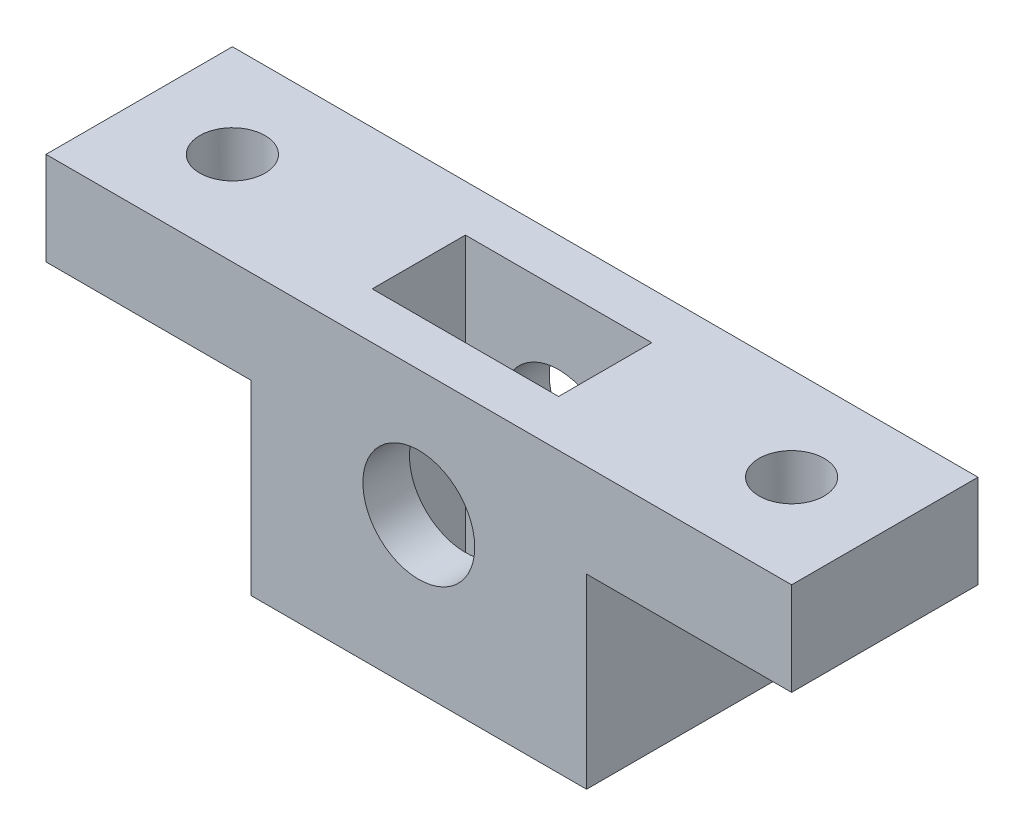
ISO-10303-21;
HEADER;
FILE_DESCRIPTION(('STEP AP214'),'2;1');
FILE_NAME('part.step','',(''),(''),'','','');
FILE_SCHEMA(('AUTOMOTIVE_DESIGN { 1 0 10303 214 1 1 1 1 }'));
ENDSEC;
DATA;
#1=APPLICATION_CONTEXT('core data for automotive mechanical design processes');
#2=APPLICATION_PROTOCOL_DEFINITION('international standard','automotive_design',2000,#1);
#3=PRODUCT_CONTEXT('',#1,'mechanical');
#4=PRODUCT('Part','Part','',(#3));
#5=PRODUCT_RELATED_PRODUCT_CATEGORY('part','',(#4));
#6=PRODUCT_DEFINITION_FORMATION('','',#4);
#7=PRODUCT_DEFINITION_CONTEXT('part definition',#1,'design');
#8=PRODUCT_DEFINITION('design','',#6,#7);
#9=PRODUCT_DEFINITION_SHAPE('','',#8);
#10=(LENGTH_UNIT() NAMED_UNIT(*) SI_UNIT(.MILLI.,.METRE.));
#11=(NAMED_UNIT(*) PLANE_ANGLE_UNIT() SI_UNIT($,.RADIAN.));
#12=(NAMED_UNIT(*) SI_UNIT($,.STERADIAN.) SOLID_ANGLE_UNIT());
#13=UNCERTAINTY_MEASURE_WITH_UNIT(LENGTH_MEASURE(1.E-05),#10,'distance_accuracy_value','');
#14=(GEOMETRIC_REPRESENTATION_CONTEXT(3) GLOBAL_UNCERTAINTY_ASSIGNED_CONTEXT((#13)) GLOBAL_UNIT_ASSIGNED_CONTEXT((#10,
#11,#12)) REPRESENTATION_CONTEXT('',''));
#15=CARTESIAN_POINT('',(0.,0.,0.));
#16=DIRECTION('',(0.,0.,1.));
#17=DIRECTION('',(1.,0.,0.));
#18=AXIS2_PLACEMENT_3D('',#15,#16,#17);
#19=CARTESIAN_POINT('',(0.,-6.74999999999999,10.));
#20=DIRECTION('',(0.,0.,-1.));
#21=DIRECTION('',(-1.,0.,0.));
#22=AXIS2_PLACEMENT_3D('',#19,#20,#21);
#23=CYLINDRICAL_SURFACE('',#22,3.);
#24=CARTESIAN_POINT('',(0.,-6.74999999999999,2.5));
#25=DIRECTION('',(0.,0.,-1.));
#26=DIRECTION('',(-1.,0.,0.));
#27=AXIS2_PLACEMENT_3D('',#24,#25,#26);
#28=CIRCLE('',#27,3.);
#29=CARTESIAN_POINT('',(-3.,-6.74999999999999,2.5));
#30=VERTEX_POINT('',#29);
#31=EDGE_CURVE('E37',#30,#30,#28,.T.);
#32=ORIENTED_EDGE('',*,*,#31,.F.);
#33=EDGE_LOOP('',(#32));
#34=FACE_BOUND('',#33,.T.);
#35=CARTESIAN_POINT('',(0.,-6.74999999999999,0.));
#36=DIRECTION('',(0.,0.,1.));
#37=DIRECTION('',(1.,0.,0.));
#38=AXIS2_PLACEMENT_3D('',#35,#36,#37);
#39=CIRCLE('',#38,3.);
#40=CARTESIAN_POINT('',(3.,-6.74999999999999,0.));
#41=VERTEX_POINT('',#40);
#42=EDGE_CURVE('E176',#41,#41,#39,.T.);
#43=ORIENTED_EDGE('',*,*,#42,.F.);
#44=EDGE_LOOP('',(#43));
#45=FACE_BOUND('',#44,.T.);
#46=ADVANCED_FACE('F33',(#34,#45),#23,.F.);
#47=CARTESIAN_POINT('',(0.,0.,10.));
#48=DIRECTION('',(0.,0.,1.));
#49=DIRECTION('',(1.,0.,0.));
#50=AXIS2_PLACEMENT_3D('',#47,#48,#49);
#51=PLANE('',#50);
#52=DIRECTION('',(0.,1.,0.));
#53=VECTOR('',#52,1.);
#54=CARTESIAN_POINT('',(9.,-5.,10.));
#55=LINE('',#54,#53);
#56=CARTESIAN_POINT('',(9.,-15.,10.));
#57=VERTEX_POINT('',#56);
#58=CARTESIAN_POINT('',(9.,-5.,10.));
#59=VERTEX_POINT('',#58);
#60=EDGE_CURVE('E179',#57,#59,#55,.T.);
#61=ORIENTED_EDGE('',*,*,#60,.T.);
#62=DIRECTION('',(1.,0.,0.));
#63=VECTOR('',#62,1.);
#64=CARTESIAN_POINT('',(20.,-4.99999999999999,10.));
#65=LINE('',#64,#63);
#66=CARTESIAN_POINT('',(20.,-4.99999999999999,10.));
#67=VERTEX_POINT('',#66);
#68=EDGE_CURVE('E182',#59,#67,#65,.T.);
#69=ORIENTED_EDGE('',*,*,#68,.T.);
#70=DIRECTION('',(0.,1.,0.));
#71=VECTOR('',#70,1.);
#72=CARTESIAN_POINT('',(20.,0.,10.));
#73=LINE('',#72,#71);
#74=CARTESIAN_POINT('',(20.,0.,10.));
#75=VERTEX_POINT('',#74);
#76=EDGE_CURVE('E185',#67,#75,#73,.T.);
#77=ORIENTED_EDGE('',*,*,#76,.T.);
#78=DIRECTION('',(-1.,0.,0.));
#79=VECTOR('',#78,1.);
#80=CARTESIAN_POINT('',(-20.,0.,10.));
#81=LINE('',#80,#79);
#82=CARTESIAN_POINT('',(-20.,0.,10.));
#83=VERTEX_POINT('',#82);
#84=EDGE_CURVE('E187',#75,#83,#81,.T.);
#85=ORIENTED_EDGE('',*,*,#84,.T.);
#86=DIRECTION('',(0.,-1.,0.));
#87=VECTOR('',#86,1.);
#88=CARTESIAN_POINT('',(-20.,0.,10.));
#89=LINE('',#88,#87);
#90=CARTESIAN_POINT('',(-20.,-5.,10.));
#91=VERTEX_POINT('',#90);
#92=EDGE_CURVE('E189',#83,#91,#89,.T.);
#93=ORIENTED_EDGE('',*,*,#92,.T.);
#94=DIRECTION('',(1.,0.,0.));
#95=VECTOR('',#94,1.);
#96=CARTESIAN_POINT('',(-20.,-5.,10.));
#97=LINE('',#96,#95);
#98=CARTESIAN_POINT('',(-9.,-5.,10.));
#99=VERTEX_POINT('',#98);
#100=EDGE_CURVE('E191',#91,#99,#97,.T.);
#101=ORIENTED_EDGE('',*,*,#100,.T.);
#102=DIRECTION('',(0.,-1.,0.));
#103=VECTOR('',#102,1.);
#104=CARTESIAN_POINT('',(-9.,-5.,10.));
#105=LINE('',#104,#103);
#106=CARTESIAN_POINT('',(-9.,-15.,10.));
#107=VERTEX_POINT('',#106);
#108=EDGE_CURVE('E193',#99,#107,#105,.T.);
#109=ORIENTED_EDGE('',*,*,#108,.T.);
#110=DIRECTION('',(1.,0.,0.));
#111=VECTOR('',#110,1.);
#112=CARTESIAN_POINT('',(-9.,-15.,10.));
#113=LINE('',#112,#111);
#114=EDGE_CURVE('E195',#107,#57,#113,.T.);
#115=ORIENTED_EDGE('',*,*,#114,.T.);
#116=EDGE_LOOP('',(#61,#69,#77,#85,#93,#101,#109,#115));
#117=FACE_BOUND('',#116,.T.);
#118=CARTESIAN_POINT('',(0.,-6.74999999999999,10.));
#119=DIRECTION('',(0.,0.,1.));
#120=DIRECTION('',(1.,0.,0.));
#121=AXIS2_PLACEMENT_3D('',#118,#119,#120);
#122=CIRCLE('',#121,3.);
#123=CARTESIAN_POINT('',(3.,-6.74999999999999,10.));
#124=VERTEX_POINT('',#123);
#125=EDGE_CURVE('E172',#124,#124,#122,.T.);
#126=ORIENTED_EDGE('',*,*,#125,.F.);
#127=EDGE_LOOP('',(#126));
#128=FACE_BOUND('',#127,.T.);
#129=ADVANCED_FACE('F244',(#117,#128),#51,.T.);
#130=CARTESIAN_POINT('',(0.,0.,0.));
#131=DIRECTION('',(0.,0.,1.));
#132=DIRECTION('',(1.,0.,0.));
#133=AXIS2_PLACEMENT_3D('',#130,#131,#132);
#134=PLANE('',#133);
#135=DIRECTION('',(0.,1.,0.));
#136=VECTOR('',#135,1.);
#137=CARTESIAN_POINT('',(9.,-5.,0.));
#138=LINE('',#137,#136);
#139=CARTESIAN_POINT('',(9.,-15.,0.));
#140=VERTEX_POINT('',#139);
#141=CARTESIAN_POINT('',(9.,-5.,0.));
#142=VERTEX_POINT('',#141);
#143=EDGE_CURVE('E175',#140,#142,#138,.T.);
#144=ORIENTED_EDGE('',*,*,#143,.F.);
#145=DIRECTION('',(1.,0.,0.));
#146=VECTOR('',#145,1.);
#147=CARTESIAN_POINT('',(-9.,-15.,0.));
#148=LINE('',#147,#146);
#149=CARTESIAN_POINT('',(-9.,-15.,0.));
#150=VERTEX_POINT('',#149);
#151=EDGE_CURVE('E183',#150,#140,#148,.T.);
#152=ORIENTED_EDGE('',*,*,#151,.F.);
#153=DIRECTION('',(0.,-1.,0.));
#154=VECTOR('',#153,1.);
#155=CARTESIAN_POINT('',(-9.,-5.,0.));
#156=LINE('',#155,#154);
#157=CARTESIAN_POINT('',(-9.,-5.,0.));
#158=VERTEX_POINT('',#157);
#159=EDGE_CURVE('E210',#158,#150,#156,.T.);
#160=ORIENTED_EDGE('',*,*,#159,.F.);
#161=DIRECTION('',(1.,0.,0.));
#162=VECTOR('',#161,1.);
#163=CARTESIAN_POINT('',(-20.,-5.,0.));
#164=LINE('',#163,#162);
#165=CARTESIAN_POINT('',(-20.,-5.,0.));
#166=VERTEX_POINT('',#165);
#167=EDGE_CURVE('E208',#166,#158,#164,.T.);
#168=ORIENTED_EDGE('',*,*,#167,.F.);
#169=DIRECTION('',(0.,-1.,0.));
#170=VECTOR('',#169,1.);
#171=CARTESIAN_POINT('',(-20.,0.,0.));
#172=LINE('',#171,#170);
#173=CARTESIAN_POINT('',(-20.,0.,0.));
#174=VERTEX_POINT('',#173);
#175=EDGE_CURVE('E206',#174,#166,#172,.T.);
#176=ORIENTED_EDGE('',*,*,#175,.F.);
#177=DIRECTION('',(-1.,0.,0.));
#178=VECTOR('',#177,1.);
#179=CARTESIAN_POINT('',(-20.,0.,0.));
#180=LINE('',#179,#178);
#181=CARTESIAN_POINT('',(20.,0.,0.));
#182=VERTEX_POINT('',#181);
#183=EDGE_CURVE('E204',#182,#174,#180,.T.);
#184=ORIENTED_EDGE('',*,*,#183,.F.);
#185=DIRECTION('',(0.,1.,0.));
#186=VECTOR('',#185,1.);
#187=CARTESIAN_POINT('',(20.,0.,0.));
#188=LINE('',#187,#186);
#189=CARTESIAN_POINT('',(20.,-4.99999999999999,0.));
#190=VERTEX_POINT('',#189);
#191=EDGE_CURVE('E202',#190,#182,#188,.T.);
#192=ORIENTED_EDGE('',*,*,#191,.F.);
#193=DIRECTION('',(1.,0.,0.));
#194=VECTOR('',#193,1.);
#195=CARTESIAN_POINT('',(20.,-4.99999999999999,0.));
#196=LINE('',#195,#194);
#197=EDGE_CURVE('E200',#142,#190,#196,.T.);
#198=ORIENTED_EDGE('',*,*,#197,.F.);
#199=EDGE_LOOP('',(#144,#152,#160,#168,#176,#184,#192,#198));
#200=FACE_BOUND('',#199,.T.);
#201=ORIENTED_EDGE('',*,*,#42,.T.);
#202=EDGE_LOOP('',(#201));
#203=FACE_BOUND('',#202,.T.);
#204=ADVANCED_FACE('F246',(#200,#203),#134,.F.);
#205=CARTESIAN_POINT('',(9.,-5.,10.));
#206=DIRECTION('',(-1.,0.,0.));
#207=DIRECTION('',(0.,-1.,0.));
#208=AXIS2_PLACEMENT_3D('',#205,#206,#207);
#209=PLANE('',#208);
#210=ORIENTED_EDGE('',*,*,#143,.T.);
#211=DIRECTION('',(0.,0.,-1.));
#212=VECTOR('',#211,1.);
#213=CARTESIAN_POINT('',(9.,-5.,10.));
#214=LINE('',#213,#212);
#215=EDGE_CURVE('E11',#59,#142,#214,.T.);
#216=ORIENTED_EDGE('',*,*,#215,.F.);
#217=ORIENTED_EDGE('',*,*,#60,.F.);
#218=DIRECTION('',(0.,0.,-1.));
#219=VECTOR('',#218,1.);
#220=CARTESIAN_POINT('',(9.,-15.,10.));
#221=LINE('',#220,#219);
#222=EDGE_CURVE('E197',#57,#140,#221,.T.);
#223=ORIENTED_EDGE('',*,*,#222,.T.);
#224=EDGE_LOOP('',(#210,#216,#217,#223));
#225=FACE_BOUND('',#224,.T.);
#226=ADVANCED_FACE('F35',(#225),#209,.F.);
#227=CARTESIAN_POINT('',(20.,-4.99999999999999,10.));
#228=DIRECTION('',(0.,1.,0.));
#229=DIRECTION('',(-1.,0.,0.));
#230=AXIS2_PLACEMENT_3D('',#227,#228,#229);
#231=PLANE('',#230);
#232=CARTESIAN_POINT('',(15.,-5.,5.));
#233=DIRECTION('',(0.,1.,0.));
#234=DIRECTION('',(-1.,0.,0.));
#235=AXIS2_PLACEMENT_3D('',#232,#233,#234);
#236=CIRCLE('',#235,1.75);
#237=CARTESIAN_POINT('',(13.25,-5.,5.));
#238=VERTEX_POINT('',#237);
#239=EDGE_CURVE('E165',#238,#238,#236,.T.);
#240=ORIENTED_EDGE('',*,*,#239,.T.);
#241=EDGE_LOOP('',(#240));
#242=FACE_BOUND('',#241,.T.);
#243=ORIENTED_EDGE('',*,*,#197,.T.);
#244=DIRECTION('',(0.,0.,-1.));
#245=VECTOR('',#244,1.);
#246=CARTESIAN_POINT('',(20.,-4.99999999999999,10.));
#247=LINE('',#246,#245);
#248=EDGE_CURVE('E42',#67,#190,#247,.T.);
#249=ORIENTED_EDGE('',*,*,#248,.F.);
#250=ORIENTED_EDGE('',*,*,#68,.F.);
#251=ORIENTED_EDGE('',*,*,#215,.T.);
#252=EDGE_LOOP('',(#243,#249,#250,#251));
#253=FACE_BOUND('',#252,.T.);
#254=ADVANCED_FACE('F278',(#242,#253),#231,.F.);
#255=CARTESIAN_POINT('',(20.,0.,10.));
#256=DIRECTION('',(-1.,0.,0.));
#257=DIRECTION('',(0.,0.,1.));
#258=AXIS2_PLACEMENT_3D('',#255,#256,#257);
#259=PLANE('',#258);
#260=ORIENTED_EDGE('',*,*,#191,.T.);
#261=DIRECTION('',(0.,0.,-1.));
#262=VECTOR('',#261,1.);
#263=CARTESIAN_POINT('',(20.,0.,10.));
#264=LINE('',#263,#262);
#265=EDGE_CURVE('E227',#75,#182,#264,.T.);
#266=ORIENTED_EDGE('',*,*,#265,.F.);
#267=ORIENTED_EDGE('',*,*,#76,.F.);
#268=ORIENTED_EDGE('',*,*,#248,.T.);
#269=EDGE_LOOP('',(#260,#266,#267,#268));
#270=FACE_BOUND('',#269,.T.);
#271=ADVANCED_FACE('F275',(#270),#259,.F.);
#272=CARTESIAN_POINT('',(-20.,0.,10.));
#273=DIRECTION('',(0.,-1.,0.));
#274=DIRECTION('',(1.,0.,0.));
#275=AXIS2_PLACEMENT_3D('',#272,#273,#274);
#276=PLANE('',#275);
#277=DIRECTION('',(1.,0.,0.));
#278=VECTOR('',#277,1.);
#279=CARTESIAN_POINT('',(-20.,0.,2.5));
#280=LINE('',#279,#278);
#281=CARTESIAN_POINT('',(-5.,0.,2.5));
#282=VERTEX_POINT('',#281);
#283=CARTESIAN_POINT('',(5.,0.,2.5));
#284=VERTEX_POINT('',#283);
#285=EDGE_CURVE('E155',#282,#284,#280,.T.);
#286=ORIENTED_EDGE('',*,*,#285,.T.);
#287=DIRECTION('',(0.,0.,1.));
#288=VECTOR('',#287,1.);
#289=CARTESIAN_POINT('',(5.,0.,10.));
#290=LINE('',#289,#288);
#291=CARTESIAN_POINT('',(5.,0.,7.5));
#292=VERTEX_POINT('',#291);
#293=EDGE_CURVE('E159',#284,#292,#290,.T.);
#294=ORIENTED_EDGE('',*,*,#293,.T.);
#295=DIRECTION('',(-1.,0.,0.));
#296=VECTOR('',#295,1.);
#297=CARTESIAN_POINT('',(-20.,0.,7.5));
#298=LINE('',#297,#296);
#299=CARTESIAN_POINT('',(-5.,0.,7.5));
#300=VERTEX_POINT('',#299);
#301=EDGE_CURVE('E153',#292,#300,#298,.T.);
#302=ORIENTED_EDGE('',*,*,#301,.T.);
#303=DIRECTION('',(0.,0.,-1.));
#304=VECTOR('',#303,1.);
#305=CARTESIAN_POINT('',(-5.,0.,10.));
#306=LINE('',#305,#304);
#307=EDGE_CURVE('E130',#300,#282,#306,.T.);
#308=ORIENTED_EDGE('',*,*,#307,.T.);
#309=EDGE_LOOP('',(#286,#294,#302,#308));
#310=FACE_BOUND('',#309,.T.);
#311=CARTESIAN_POINT('',(15.,0.,5.));
#312=DIRECTION('',(0.,1.,0.));
#313=DIRECTION('',(1.,0.,0.));
#314=AXIS2_PLACEMENT_3D('',#311,#312,#313);
#315=CIRCLE('',#314,1.75);
#316=CARTESIAN_POINT('',(16.75,0.,5.));
#317=VERTEX_POINT('',#316);
#318=EDGE_CURVE('E162',#317,#317,#315,.T.);
#319=ORIENTED_EDGE('',*,*,#318,.F.);
#320=EDGE_LOOP('',(#319));
#321=FACE_BOUND('',#320,.T.);
#322=CARTESIAN_POINT('',(-15.,0.,5.));
#323=DIRECTION('',(0.,1.,0.));
#324=DIRECTION('',(-1.,0.,0.));
#325=AXIS2_PLACEMENT_3D('',#322,#323,#324);
#326=CIRCLE('',#325,1.75);
#327=CARTESIAN_POINT('',(-16.75,0.,5.));
#328=VERTEX_POINT('',#327);
#329=EDGE_CURVE('E168',#328,#328,#326,.T.);
#330=ORIENTED_EDGE('',*,*,#329,.F.);
#331=EDGE_LOOP('',(#330));
#332=FACE_BOUND('',#331,.T.);
#333=ORIENTED_EDGE('',*,*,#183,.T.);
#334=DIRECTION('',(0.,0.,-1.));
#335=VECTOR('',#334,1.);
#336=CARTESIAN_POINT('',(-20.,0.,10.));
#337=LINE('',#336,#335);
#338=EDGE_CURVE('E224',#83,#174,#337,.T.);
#339=ORIENTED_EDGE('',*,*,#338,.F.);
#340=ORIENTED_EDGE('',*,*,#84,.F.);
#341=ORIENTED_EDGE('',*,*,#265,.T.);
#342=EDGE_LOOP('',(#333,#339,#340,#341));
#343=FACE_BOUND('',#342,.T.);
#344=ADVANCED_FACE('F271',(#310,#321,#332,#343),#276,.F.);
#345=CARTESIAN_POINT('',(-20.,0.,10.));
#346=DIRECTION('',(1.,0.,0.));
#347=DIRECTION('',(0.,0.,-1.));
#348=AXIS2_PLACEMENT_3D('',#345,#346,#347);
#349=PLANE('',#348);
#350=ORIENTED_EDGE('',*,*,#175,.T.);
#351=DIRECTION('',(0.,0.,-1.));
#352=VECTOR('',#351,1.);
#353=CARTESIAN_POINT('',(-20.,-5.,10.));
#354=LINE('',#353,#352);
#355=EDGE_CURVE('E221',#91,#166,#354,.T.);
#356=ORIENTED_EDGE('',*,*,#355,.F.);
#357=ORIENTED_EDGE('',*,*,#92,.F.);
#358=ORIENTED_EDGE('',*,*,#338,.T.);
#359=EDGE_LOOP('',(#350,#356,#357,#358));
#360=FACE_BOUND('',#359,.T.);
#361=ADVANCED_FACE('F267',(#360),#349,.F.);
#362=CARTESIAN_POINT('',(-20.,-5.,10.));
#363=DIRECTION('',(0.,1.,0.));
#364=DIRECTION('',(0.,0.,1.));
#365=AXIS2_PLACEMENT_3D('',#362,#363,#364);
#366=PLANE('',#365);
#367=CARTESIAN_POINT('',(-15.,-5.,5.));
#368=DIRECTION('',(0.,1.,0.));
#369=DIRECTION('',(0.,0.,1.));
#370=AXIS2_PLACEMENT_3D('',#367,#368,#369);
#371=CIRCLE('',#370,1.75);
#372=CARTESIAN_POINT('',(-15.,-5.,6.75));
#373=VERTEX_POINT('',#372);
#374=EDGE_CURVE('E171',#373,#373,#371,.T.);
#375=ORIENTED_EDGE('',*,*,#374,.T.);
#376=EDGE_LOOP('',(#375));
#377=FACE_BOUND('',#376,.T.);
#378=ORIENTED_EDGE('',*,*,#167,.T.);
#379=DIRECTION('',(0.,0.,-1.));
#380=VECTOR('',#379,1.);
#381=CARTESIAN_POINT('',(-9.,-5.,10.));
#382=LINE('',#381,#380);
#383=EDGE_CURVE('E218',#99,#158,#382,.T.);
#384=ORIENTED_EDGE('',*,*,#383,.F.);
#385=ORIENTED_EDGE('',*,*,#100,.F.);
#386=ORIENTED_EDGE('',*,*,#355,.T.);
#387=EDGE_LOOP('',(#378,#384,#385,#386));
#388=FACE_BOUND('',#387,.T.);
#389=ADVANCED_FACE('F263',(#377,#388),#366,.F.);
#390=CARTESIAN_POINT('',(-9.,-5.,10.));
#391=DIRECTION('',(1.,0.,0.));
#392=DIRECTION('',(0.,0.,-1.));
#393=AXIS2_PLACEMENT_3D('',#390,#391,#392);
#394=PLANE('',#393);
#395=ORIENTED_EDGE('',*,*,#159,.T.);
#396=DIRECTION('',(0.,0.,-1.));
#397=VECTOR('',#396,1.);
#398=CARTESIAN_POINT('',(-9.,-15.,10.));
#399=LINE('',#398,#397);
#400=EDGE_CURVE('E215',#107,#150,#399,.T.);
#401=ORIENTED_EDGE('',*,*,#400,.F.);
#402=ORIENTED_EDGE('',*,*,#108,.F.);
#403=ORIENTED_EDGE('',*,*,#383,.T.);
#404=EDGE_LOOP('',(#395,#401,#402,#403));
#405=FACE_BOUND('',#404,.T.);
#406=ADVANCED_FACE('F260',(#405),#394,.F.);
#407=CARTESIAN_POINT('',(-9.,-15.,10.));
#408=DIRECTION('',(0.,1.,0.));
#409=DIRECTION('',(-1.,0.,0.));
#410=AXIS2_PLACEMENT_3D('',#407,#408,#409);
#411=PLANE('',#410);
#412=DIRECTION('',(-1.,0.,0.));
#413=VECTOR('',#412,1.);
#414=CARTESIAN_POINT('',(-5.,-15.,7.5));
#415=LINE('',#414,#413);
#416=CARTESIAN_POINT('',(5.,-15.,7.5));
#417=VERTEX_POINT('',#416);
#418=CARTESIAN_POINT('',(-5.,-15.,7.5));
#419=VERTEX_POINT('',#418);
#420=EDGE_CURVE('E136',#417,#419,#415,.T.);
#421=ORIENTED_EDGE('',*,*,#420,.F.);
#422=DIRECTION('',(0.,0.,1.));
#423=VECTOR('',#422,1.);
#424=CARTESIAN_POINT('',(5.,-15.,7.5));
#425=LINE('',#424,#423);
#426=CARTESIAN_POINT('',(5.,-15.,2.5));
#427=VERTEX_POINT('',#426);
#428=EDGE_CURVE('E58',#427,#417,#425,.T.);
#429=ORIENTED_EDGE('',*,*,#428,.F.);
#430=DIRECTION('',(1.,0.,0.));
#431=VECTOR('',#430,1.);
#432=CARTESIAN_POINT('',(-5.,-15.,2.5));
#433=LINE('',#432,#431);
#434=CARTESIAN_POINT('',(-5.,-15.,2.5));
#435=VERTEX_POINT('',#434);
#436=EDGE_CURVE('E143',#435,#427,#433,.T.);
#437=ORIENTED_EDGE('',*,*,#436,.F.);
#438=DIRECTION('',(0.,0.,-1.));
#439=VECTOR('',#438,1.);
#440=CARTESIAN_POINT('',(-5.,-15.,7.5));
#441=LINE('',#440,#439);
#442=EDGE_CURVE('E127',#419,#435,#441,.T.);
#443=ORIENTED_EDGE('',*,*,#442,.F.);
#444=EDGE_LOOP('',(#421,#429,#437,#443));
#445=FACE_BOUND('',#444,.T.);
#446=ORIENTED_EDGE('',*,*,#151,.T.);
#447=ORIENTED_EDGE('',*,*,#222,.F.);
#448=ORIENTED_EDGE('',*,*,#114,.F.);
#449=ORIENTED_EDGE('',*,*,#400,.T.);
#450=EDGE_LOOP('',(#446,#447,#448,#449));
#451=FACE_BOUND('',#450,.T.);
#452=ADVANCED_FACE('F140',(#445,#451),#411,.F.);
#453=CARTESIAN_POINT('',(0.,-6.74999999999999,7.5));
#454=DIRECTION('',(0.,0.,1.));
#455=DIRECTION('',(1.,0.,0.));
#456=AXIS2_PLACEMENT_3D('',#453,#454,#455);
#457=CIRCLE('',#456,3.);
#458=CARTESIAN_POINT('',(3.,-6.74999999999999,7.5));
#459=VERTEX_POINT('',#458);
#460=EDGE_CURVE('E150',#459,#459,#457,.T.);
#461=ORIENTED_EDGE('',*,*,#460,.F.);
#462=EDGE_LOOP('',(#461));
#463=FACE_BOUND('',#462,.T.);
#464=ORIENTED_EDGE('',*,*,#125,.T.);
#465=EDGE_LOOP('',(#464));
#466=FACE_BOUND('',#465,.T.);
#467=ADVANCED_FACE('F237',(#463,#466),#23,.F.);
#468=CARTESIAN_POINT('',(-15.,-10.,5.));
#469=DIRECTION('',(0.,1.,0.));
#470=DIRECTION('',(-1.,0.,0.));
#471=AXIS2_PLACEMENT_3D('',#468,#469,#470);
#472=CYLINDRICAL_SURFACE('',#471,1.75);
#473=ORIENTED_EDGE('',*,*,#329,.T.);
#474=EDGE_LOOP('',(#473));
#475=FACE_BOUND('',#474,.T.);
#476=ORIENTED_EDGE('',*,*,#374,.F.);
#477=EDGE_LOOP('',(#476));
#478=FACE_BOUND('',#477,.T.);
#479=ADVANCED_FACE('F240',(#475,#478),#472,.F.);
#480=CARTESIAN_POINT('',(15.,-10.,5.));
#481=DIRECTION('',(0.,1.,0.));
#482=DIRECTION('',(-1.,0.,0.));
#483=AXIS2_PLACEMENT_3D('',#480,#481,#482);
#484=CYLINDRICAL_SURFACE('',#483,1.75);
#485=ORIENTED_EDGE('',*,*,#318,.T.);
#486=EDGE_LOOP('',(#485));
#487=FACE_BOUND('',#486,.T.);
#488=ORIENTED_EDGE('',*,*,#239,.F.);
#489=EDGE_LOOP('',(#488));
#490=FACE_BOUND('',#489,.T.);
#491=ADVANCED_FACE('F316',(#487,#490),#484,.F.);
#492=CARTESIAN_POINT('',(5.,5.,7.5));
#493=DIRECTION('',(1.,0.,0.));
#494=DIRECTION('',(0.,0.,-1.));
#495=AXIS2_PLACEMENT_3D('',#492,#493,#494);
#496=PLANE('',#495);
#497=DIRECTION('',(0.,-1.,0.));
#498=VECTOR('',#497,1.);
#499=CARTESIAN_POINT('',(5.,5.,2.5));
#500=LINE('',#499,#498);
#501=EDGE_CURVE('E148',#284,#427,#500,.T.);
#502=ORIENTED_EDGE('',*,*,#501,.T.);
#503=ORIENTED_EDGE('',*,*,#428,.T.);
#504=DIRECTION('',(0.,-1.,0.));
#505=VECTOR('',#504,1.);
#506=CARTESIAN_POINT('',(5.,5.,7.5));
#507=LINE('',#506,#505);
#508=EDGE_CURVE('E133',#292,#417,#507,.T.);
#509=ORIENTED_EDGE('',*,*,#508,.F.);
#510=ORIENTED_EDGE('',*,*,#293,.F.);
#511=EDGE_LOOP('',(#502,#503,#509,#510));
#512=FACE_BOUND('',#511,.T.);
#513=ADVANCED_FACE('F318',(#512),#496,.F.);
#514=CARTESIAN_POINT('',(-5.,5.,7.5));
#515=DIRECTION('',(-1.,0.,0.));
#516=DIRECTION('',(0.,0.,1.));
#517=AXIS2_PLACEMENT_3D('',#514,#515,#516);
#518=PLANE('',#517);
#519=DIRECTION('',(0.,-1.,0.));
#520=VECTOR('',#519,1.);
#521=CARTESIAN_POINT('',(-5.,5.,7.5));
#522=LINE('',#521,#520);
#523=EDGE_CURVE('E50',#300,#419,#522,.T.);
#524=ORIENTED_EDGE('',*,*,#523,.T.);
#525=ORIENTED_EDGE('',*,*,#442,.T.);
#526=DIRECTION('',(0.,-1.,0.));
#527=VECTOR('',#526,1.);
#528=CARTESIAN_POINT('',(-5.,5.,2.5));
#529=LINE('',#528,#527);
#530=EDGE_CURVE('E132',#282,#435,#529,.T.);
#531=ORIENTED_EDGE('',*,*,#530,.F.);
#532=ORIENTED_EDGE('',*,*,#307,.F.);
#533=EDGE_LOOP('',(#524,#525,#531,#532));
#534=FACE_BOUND('',#533,.T.);
#535=ADVANCED_FACE('F124',(#534),#518,.F.);
#536=CARTESIAN_POINT('',(-5.,5.,2.5));
#537=DIRECTION('',(0.,0.,-1.));
#538=DIRECTION('',(-1.,0.,0.));
#539=AXIS2_PLACEMENT_3D('',#536,#537,#538);
#540=PLANE('',#539);
#541=ORIENTED_EDGE('',*,*,#31,.T.);
#542=EDGE_LOOP('',(#541));
#543=FACE_BOUND('',#542,.T.);
#544=ORIENTED_EDGE('',*,*,#530,.T.);
#545=ORIENTED_EDGE('',*,*,#436,.T.);
#546=ORIENTED_EDGE('',*,*,#501,.F.);
#547=ORIENTED_EDGE('',*,*,#285,.F.);
#548=EDGE_LOOP('',(#544,#545,#546,#547));
#549=FACE_BOUND('',#548,.T.);
#550=ADVANCED_FACE('F330',(#543,#549),#540,.F.);
#551=CARTESIAN_POINT('',(-5.,5.,7.5));
#552=DIRECTION('',(0.,0.,1.));
#553=DIRECTION('',(1.,0.,0.));
#554=AXIS2_PLACEMENT_3D('',#551,#552,#553);
#555=PLANE('',#554);
#556=ORIENTED_EDGE('',*,*,#460,.T.);
#557=EDGE_LOOP('',(#556));
#558=FACE_BOUND('',#557,.T.);
#559=ORIENTED_EDGE('',*,*,#508,.T.);
#560=ORIENTED_EDGE('',*,*,#420,.T.);
#561=ORIENTED_EDGE('',*,*,#523,.F.);
#562=ORIENTED_EDGE('',*,*,#301,.F.);
#563=EDGE_LOOP('',(#559,#560,#561,#562));
#564=FACE_BOUND('',#563,.T.);
#565=ADVANCED_FACE('F137',(#558,#564),#555,.F.);
#566=CLOSED_SHELL('',(#46,#129,#204,#226,#254,#271,#344,#361,#389,#406,#452,#467,#479,#491,#513,
#535,#550,#565));
#567=MANIFOLD_SOLID_BREP('B2',#566);
#568=ADVANCED_BREP_SHAPE_REPRESENTATION('',(#18,#567),#14);
#569=SHAPE_DEFINITION_REPRESENTATION(#9,#568);
ENDSEC;
END-ISO-10303-21;
